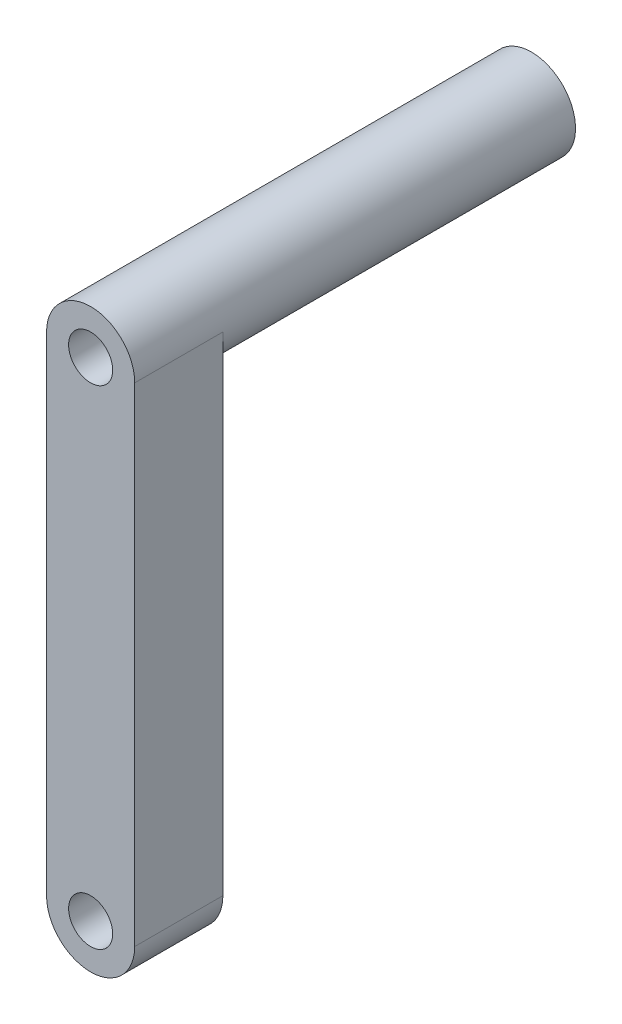
ISO-10303-21;
HEADER;
FILE_DESCRIPTION(('STEP AP214'),'2;1');
FILE_NAME('part.step','',(''),(''),'','','');
FILE_SCHEMA(('AUTOMOTIVE_DESIGN { 1 0 10303 214 1 1 1 1 }'));
ENDSEC;
DATA;
#1=APPLICATION_CONTEXT('core data for automotive mechanical design processes');
#2=APPLICATION_PROTOCOL_DEFINITION('international standard','automotive_design',2000,#1);
#3=PRODUCT_CONTEXT('',#1,'mechanical');
#4=PRODUCT('Part','Part','',(#3));
#5=PRODUCT_RELATED_PRODUCT_CATEGORY('part','',(#4));
#6=PRODUCT_DEFINITION_FORMATION('','',#4);
#7=PRODUCT_DEFINITION_CONTEXT('part definition',#1,'design');
#8=PRODUCT_DEFINITION('design','',#6,#7);
#9=PRODUCT_DEFINITION_SHAPE('','',#8);
#10=(LENGTH_UNIT() NAMED_UNIT(*) SI_UNIT(.MILLI.,.METRE.));
#11=(NAMED_UNIT(*) PLANE_ANGLE_UNIT() SI_UNIT($,.RADIAN.));
#12=(NAMED_UNIT(*) SI_UNIT($,.STERADIAN.) SOLID_ANGLE_UNIT());
#13=UNCERTAINTY_MEASURE_WITH_UNIT(LENGTH_MEASURE(1.E-05),#10,'distance_accuracy_value','');
#14=(GEOMETRIC_REPRESENTATION_CONTEXT(3) GLOBAL_UNCERTAINTY_ASSIGNED_CONTEXT((#13)) GLOBAL_UNIT_ASSIGNED_CONTEXT((#10,
#11,#12)) REPRESENTATION_CONTEXT('',''));
#15=CARTESIAN_POINT('',(0.,0.,0.));
#16=DIRECTION('',(0.,0.,1.));
#17=DIRECTION('',(1.,0.,0.));
#18=AXIS2_PLACEMENT_3D('',#15,#16,#17);
#19=CARTESIAN_POINT('',(-0.0925515080141318,6.02944820709541,2.));
#20=DIRECTION('',(0.,0.,1.));
#21=DIRECTION('',(1.,0.,0.));
#22=AXIS2_PLACEMENT_3D('',#19,#20,#21);
#23=PLANE('',#22);
#24=CARTESIAN_POINT('',(-0.0925515080141326,-5.04553556763522,2.));
#25=DIRECTION('',(0.,0.,1.));
#26=DIRECTION('',(1.,0.,0.));
#27=AXIS2_PLACEMENT_3D('',#24,#25,#26);
#28=CIRCLE('',#27,0.5);
#29=CARTESIAN_POINT('',(0.407448491985868,-5.04553556763522,2.));
#30=VERTEX_POINT('',#29);
#31=EDGE_CURVE('E92',#30,#30,#28,.T.);
#32=ORIENTED_EDGE('',*,*,#31,.F.);
#33=EDGE_LOOP('',(#32));
#34=FACE_BOUND('',#33,.T.);
#35=CARTESIAN_POINT('',(-0.0925515080141318,6.02944820709541,2.));
#36=DIRECTION('',(0.,0.,1.));
#37=DIRECTION('',(1.,0.,0.));
#38=AXIS2_PLACEMENT_3D('',#35,#36,#37);
#39=CIRCLE('',#38,1.);
#40=CARTESIAN_POINT('',(0.907448491985868,6.02944820709541,2.));
#41=VERTEX_POINT('',#40);
#42=CARTESIAN_POINT('',(-1.09255150801413,6.02944820709541,2.));
#43=VERTEX_POINT('',#42);
#44=EDGE_CURVE('E97',#41,#43,#39,.T.);
#45=ORIENTED_EDGE('',*,*,#44,.T.);
#46=DIRECTION('',(0.,-1.,0.));
#47=VECTOR('',#46,1.);
#48=CARTESIAN_POINT('',(-1.09255150801413,-5.04553556763522,2.));
#49=LINE('',#48,#47);
#50=CARTESIAN_POINT('',(-1.09255150801414,-5.04553556763522,2.));
#51=VERTEX_POINT('',#50);
#52=EDGE_CURVE('E82',#43,#51,#49,.T.);
#53=ORIENTED_EDGE('',*,*,#52,.T.);
#54=CARTESIAN_POINT('',(-0.0925515080141326,-5.04553556763522,2.));
#55=DIRECTION('',(0.,0.,1.));
#56=DIRECTION('',(1.,0.,0.));
#57=AXIS2_PLACEMENT_3D('',#54,#55,#56);
#58=CIRCLE('',#57,1.00000000000001);
#59=CARTESIAN_POINT('',(0.907448491985868,-5.04553541653116,2.));
#60=VERTEX_POINT('',#59);
#61=EDGE_CURVE('E102',#51,#60,#58,.T.);
#62=ORIENTED_EDGE('',*,*,#61,.T.);
#63=DIRECTION('',(0.,1.,0.));
#64=VECTOR('',#63,1.);
#65=CARTESIAN_POINT('',(0.907448491985868,-5.04553541653116,2.));
#66=LINE('',#65,#64);
#67=EDGE_CURVE('E53',#60,#41,#66,.T.);
#68=ORIENTED_EDGE('',*,*,#67,.T.);
#69=EDGE_LOOP('',(#45,#53,#62,#68));
#70=FACE_BOUND('',#69,.T.);
#71=CARTESIAN_POINT('',(-0.0925515080141318,6.02944820709541,2.));
#72=DIRECTION('',(0.,0.,1.));
#73=DIRECTION('',(1.,0.,0.));
#74=AXIS2_PLACEMENT_3D('',#71,#72,#73);
#75=CIRCLE('',#74,0.500000000000001);
#76=CARTESIAN_POINT('',(0.40744849198587,6.02944820709541,2.));
#77=VERTEX_POINT('',#76);
#78=EDGE_CURVE('E116',#77,#77,#75,.T.);
#79=ORIENTED_EDGE('',*,*,#78,.F.);
#80=EDGE_LOOP('',(#79));
#81=FACE_BOUND('',#80,.T.);
#82=ADVANCED_FACE('F35',(#34,#70,#81),#23,.T.);
#83=CARTESIAN_POINT('',(-0.0925515080141318,6.02944820709541,0.));
#84=DIRECTION('',(0.,0.,1.));
#85=DIRECTION('',(1.,0.,0.));
#86=AXIS2_PLACEMENT_3D('',#83,#84,#85);
#87=PLANE('',#86);
#88=CARTESIAN_POINT('',(-0.0925515080141318,6.02944820709541,0.));
#89=DIRECTION('',(0.,0.,-1.));
#90=DIRECTION('',(-1.,0.,0.));
#91=AXIS2_PLACEMENT_3D('',#88,#89,#90);
#92=CIRCLE('',#91,1.);
#93=CARTESIAN_POINT('',(0.907448491985868,6.02944820709541,0.));
#94=VERTEX_POINT('',#93);
#95=CARTESIAN_POINT('',(-1.09255150801413,6.02944820709541,0.));
#96=VERTEX_POINT('',#95);
#97=EDGE_CURVE('E11',#94,#96,#92,.T.);
#98=ORIENTED_EDGE('',*,*,#97,.F.);
#99=DIRECTION('',(0.,1.,0.));
#100=VECTOR('',#99,1.);
#101=CARTESIAN_POINT('',(0.907448491985868,-5.04553541653116,0.));
#102=LINE('',#101,#100);
#103=CARTESIAN_POINT('',(0.907448491985868,-5.04553541653116,0.));
#104=VERTEX_POINT('',#103);
#105=EDGE_CURVE('E105',#104,#94,#102,.T.);
#106=ORIENTED_EDGE('',*,*,#105,.F.);
#107=CARTESIAN_POINT('',(-0.0925515080141326,-5.04553556763522,0.));
#108=DIRECTION('',(0.,0.,1.));
#109=DIRECTION('',(1.,0.,0.));
#110=AXIS2_PLACEMENT_3D('',#107,#108,#109);
#111=CIRCLE('',#110,1.00000000000001);
#112=CARTESIAN_POINT('',(-1.09255150801414,-5.04553556763522,0.));
#113=VERTEX_POINT('',#112);
#114=EDGE_CURVE('E68',#113,#104,#111,.T.);
#115=ORIENTED_EDGE('',*,*,#114,.F.);
#116=DIRECTION('',(0.,-1.,0.));
#117=VECTOR('',#116,1.);
#118=CARTESIAN_POINT('',(-1.09255150801413,-5.04553556763522,0.));
#119=LINE('',#118,#117);
#120=EDGE_CURVE('E86',#96,#113,#119,.T.);
#121=ORIENTED_EDGE('',*,*,#120,.F.);
#122=EDGE_LOOP('',(#98,#106,#115,#121));
#123=FACE_BOUND('',#122,.T.);
#124=CARTESIAN_POINT('',(-0.0925515080141326,-5.04553556763522,0.));
#125=DIRECTION('',(0.,0.,1.));
#126=DIRECTION('',(1.,0.,0.));
#127=AXIS2_PLACEMENT_3D('',#124,#125,#126);
#128=CIRCLE('',#127,0.5);
#129=CARTESIAN_POINT('',(0.407448491985868,-5.04553556763522,0.));
#130=VERTEX_POINT('',#129);
#131=EDGE_CURVE('E113',#130,#130,#128,.T.);
#132=ORIENTED_EDGE('',*,*,#131,.T.);
#133=EDGE_LOOP('',(#132));
#134=FACE_BOUND('',#133,.T.);
#135=ADVANCED_FACE('F90',(#123,#134),#87,.F.);
#136=CARTESIAN_POINT('',(-0.0925515080141318,6.02944820709541,2.));
#137=DIRECTION('',(0.,0.,-1.));
#138=DIRECTION('',(-1.,0.,0.));
#139=AXIS2_PLACEMENT_3D('',#136,#137,#138);
#140=CYLINDRICAL_SURFACE('',#139,1.);
#141=DIRECTION('',(0.,0.,-1.));
#142=VECTOR('',#141,1.);
#143=CARTESIAN_POINT('',(0.907448491985868,6.02944820709541,2.));
#144=LINE('',#143,#142);
#145=EDGE_CURVE('E96',#41,#94,#144,.T.);
#146=ORIENTED_EDGE('',*,*,#145,.T.);
#147=ORIENTED_EDGE('',*,*,#97,.T.);
#148=DIRECTION('',(0.,0.,-1.));
#149=VECTOR('',#148,1.);
#150=CARTESIAN_POINT('',(-1.09255150801413,6.02944820709541,2.));
#151=LINE('',#150,#149);
#152=EDGE_CURVE('E39',#43,#96,#151,.T.);
#153=ORIENTED_EDGE('',*,*,#152,.F.);
#154=ORIENTED_EDGE('',*,*,#44,.F.);
#155=EDGE_LOOP('',(#146,#147,#153,#154));
#156=FACE_BOUND('',#155,.T.);
#157=CARTESIAN_POINT('',(-0.0925515080141318,6.02944820709541,-8.));
#158=DIRECTION('',(0.,0.,-1.));
#159=DIRECTION('',(-1.,0.,0.));
#160=AXIS2_PLACEMENT_3D('',#157,#158,#159);
#161=CIRCLE('',#160,1.);
#162=CARTESIAN_POINT('',(-1.09255150801413,6.02944820709541,-8.));
#163=VERTEX_POINT('',#162);
#164=EDGE_CURVE('E120',#163,#163,#161,.T.);
#165=ORIENTED_EDGE('',*,*,#164,.F.);
#166=EDGE_LOOP('',(#165));
#167=FACE_BOUND('',#166,.T.);
#168=ADVANCED_FACE('F37',(#156,#167),#140,.T.);
#169=CARTESIAN_POINT('',(-1.09255150801413,-5.04553556763522,2.));
#170=DIRECTION('',(1.,0.,0.));
#171=DIRECTION('',(0.,0.,-1.));
#172=AXIS2_PLACEMENT_3D('',#169,#170,#171);
#173=PLANE('',#172);
#174=ORIENTED_EDGE('',*,*,#120,.T.);
#175=DIRECTION('',(0.,0.,-1.));
#176=VECTOR('',#175,1.);
#177=CARTESIAN_POINT('',(-1.09255150801414,-5.04553556763522,2.));
#178=LINE('',#177,#176);
#179=EDGE_CURVE('E89',#51,#113,#178,.T.);
#180=ORIENTED_EDGE('',*,*,#179,.F.);
#181=ORIENTED_EDGE('',*,*,#52,.F.);
#182=ORIENTED_EDGE('',*,*,#152,.T.);
#183=EDGE_LOOP('',(#174,#180,#181,#182));
#184=FACE_BOUND('',#183,.T.);
#185=ADVANCED_FACE('F85',(#184),#173,.F.);
#186=CARTESIAN_POINT('',(-0.0925515080141326,-5.04553556763522,2.));
#187=DIRECTION('',(0.,0.,-1.));
#188=DIRECTION('',(-1.,0.,0.));
#189=AXIS2_PLACEMENT_3D('',#186,#187,#188);
#190=CYLINDRICAL_SURFACE('',#189,1.00000000000001);
#191=ORIENTED_EDGE('',*,*,#114,.T.);
#192=DIRECTION('',(0.,0.,-1.));
#193=VECTOR('',#192,1.);
#194=CARTESIAN_POINT('',(0.907448491985868,-5.04553541653116,2.));
#195=LINE('',#194,#193);
#196=EDGE_CURVE('E99',#60,#104,#195,.T.);
#197=ORIENTED_EDGE('',*,*,#196,.F.);
#198=ORIENTED_EDGE('',*,*,#61,.F.);
#199=ORIENTED_EDGE('',*,*,#179,.T.);
#200=EDGE_LOOP('',(#191,#197,#198,#199));
#201=FACE_BOUND('',#200,.T.);
#202=ADVANCED_FACE('F108',(#201),#190,.T.);
#203=CARTESIAN_POINT('',(0.907448491985868,-5.04553541653116,2.));
#204=DIRECTION('',(-1.,0.,0.));
#205=DIRECTION('',(0.,0.,1.));
#206=AXIS2_PLACEMENT_3D('',#203,#204,#205);
#207=PLANE('',#206);
#208=ORIENTED_EDGE('',*,*,#105,.T.);
#209=ORIENTED_EDGE('',*,*,#145,.F.);
#210=ORIENTED_EDGE('',*,*,#67,.F.);
#211=ORIENTED_EDGE('',*,*,#196,.T.);
#212=EDGE_LOOP('',(#208,#209,#210,#211));
#213=FACE_BOUND('',#212,.T.);
#214=ADVANCED_FACE('F150',(#213),#207,.F.);
#215=CARTESIAN_POINT('',(-0.0925515080141326,-5.04553556763522,2.));
#216=DIRECTION('',(0.,0.,-1.));
#217=DIRECTION('',(-1.,0.,0.));
#218=AXIS2_PLACEMENT_3D('',#215,#216,#217);
#219=CYLINDRICAL_SURFACE('',#218,0.5);
#220=ORIENTED_EDGE('',*,*,#31,.T.);
#221=EDGE_LOOP('',(#220));
#222=FACE_BOUND('',#221,.T.);
#223=ORIENTED_EDGE('',*,*,#131,.F.);
#224=EDGE_LOOP('',(#223));
#225=FACE_BOUND('',#224,.T.);
#226=ADVANCED_FACE('F137',(#222,#225),#219,.F.);
#227=CARTESIAN_POINT('',(-0.0925515080141318,6.02944820709541,2.));
#228=DIRECTION('',(0.,0.,-1.));
#229=DIRECTION('',(-1.,0.,0.));
#230=AXIS2_PLACEMENT_3D('',#227,#228,#229);
#231=CYLINDRICAL_SURFACE('',#230,0.500000000000001);
#232=ORIENTED_EDGE('',*,*,#78,.T.);
#233=EDGE_LOOP('',(#232));
#234=FACE_BOUND('',#233,.T.);
#235=CARTESIAN_POINT('',(-0.0925515080141318,6.02944820709541,-8.));
#236=DIRECTION('',(0.,0.,-1.));
#237=DIRECTION('',(-1.,0.,0.));
#238=AXIS2_PLACEMENT_3D('',#235,#236,#237);
#239=CIRCLE('',#238,0.500000000000001);
#240=CARTESIAN_POINT('',(-0.592551508014133,6.02944820709541,-8.));
#241=VERTEX_POINT('',#240);
#242=EDGE_CURVE('E124',#241,#241,#239,.T.);
#243=ORIENTED_EDGE('',*,*,#242,.T.);
#244=EDGE_LOOP('',(#243));
#245=FACE_BOUND('',#244,.T.);
#246=ADVANCED_FACE('F128',(#234,#245),#231,.F.);
#247=CARTESIAN_POINT('',(-0.0925515080141318,6.02944820709541,-8.));
#248=DIRECTION('',(0.,0.,-1.));
#249=DIRECTION('',(-1.,0.,0.));
#250=AXIS2_PLACEMENT_3D('',#247,#248,#249);
#251=PLANE('',#250);
#252=ORIENTED_EDGE('',*,*,#164,.T.);
#253=EDGE_LOOP('',(#252));
#254=FACE_BOUND('',#253,.T.);
#255=ORIENTED_EDGE('',*,*,#242,.F.);
#256=EDGE_LOOP('',(#255));
#257=FACE_BOUND('',#256,.T.);
#258=ADVANCED_FACE('F130',(#254,#257),#251,.T.);
#259=CLOSED_SHELL('',(#82,#135,#168,#185,#202,#214,#226,#246,#258));
#260=MANIFOLD_SOLID_BREP('B2',#259);
#261=ADVANCED_BREP_SHAPE_REPRESENTATION('',(#18,#260),#14);
#262=SHAPE_DEFINITION_REPRESENTATION(#9,#261);
ENDSEC;
END-ISO-10303-21;
